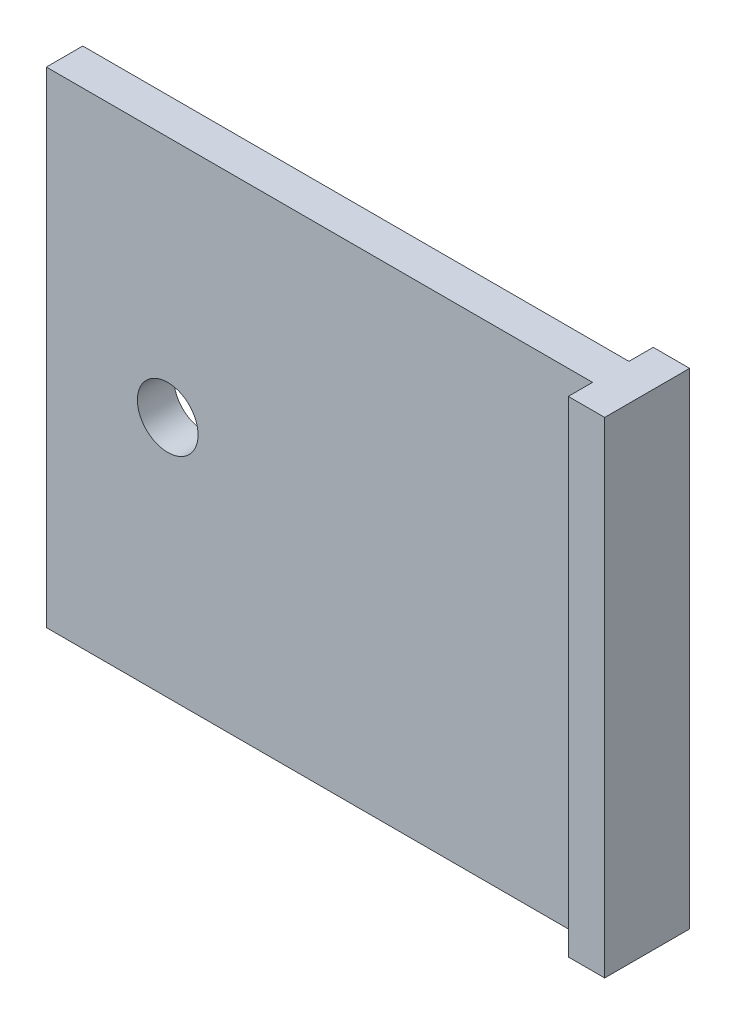
ISO-10303-21;
HEADER;
FILE_DESCRIPTION(('STEP AP214'),'2;1');
FILE_NAME('part.step','',(''),(''),'','','');
FILE_SCHEMA(('AUTOMOTIVE_DESIGN { 1 0 10303 214 1 1 1 1 }'));
ENDSEC;
DATA;
#1=APPLICATION_CONTEXT('core data for automotive mechanical design processes');
#2=APPLICATION_PROTOCOL_DEFINITION('international standard','automotive_design',2000,#1);
#3=PRODUCT_CONTEXT('',#1,'mechanical');
#4=PRODUCT('Part','Part','',(#3));
#5=PRODUCT_RELATED_PRODUCT_CATEGORY('part','',(#4));
#6=PRODUCT_DEFINITION_FORMATION('','',#4);
#7=PRODUCT_DEFINITION_CONTEXT('part definition',#1,'design');
#8=PRODUCT_DEFINITION('design','',#6,#7);
#9=PRODUCT_DEFINITION_SHAPE('','',#8);
#10=(LENGTH_UNIT() NAMED_UNIT(*) SI_UNIT(.MILLI.,.METRE.));
#11=(NAMED_UNIT(*) PLANE_ANGLE_UNIT() SI_UNIT($,.RADIAN.));
#12=(NAMED_UNIT(*) SI_UNIT($,.STERADIAN.) SOLID_ANGLE_UNIT());
#13=UNCERTAINTY_MEASURE_WITH_UNIT(LENGTH_MEASURE(1.E-05),#10,'distance_accuracy_value','');
#14=(GEOMETRIC_REPRESENTATION_CONTEXT(3) GLOBAL_UNCERTAINTY_ASSIGNED_CONTEXT((#13)) GLOBAL_UNIT_ASSIGNED_CONTEXT((#10,
#11,#12)) REPRESENTATION_CONTEXT('',''));
#15=CARTESIAN_POINT('',(0.,0.,0.));
#16=DIRECTION('',(0.,0.,1.));
#17=DIRECTION('',(1.,0.,0.));
#18=AXIS2_PLACEMENT_3D('',#15,#16,#17);
#19=CARTESIAN_POINT('',(0.,0.,3.));
#20=DIRECTION('',(0.,0.,-1.));
#21=DIRECTION('',(-1.,0.,0.));
#22=AXIS2_PLACEMENT_3D('',#19,#20,#21);
#23=PLANE('',#22);
#24=DIRECTION('',(0.,1.,0.));
#25=VECTOR('',#24,1.);
#26=CARTESIAN_POINT('',(22.5,-20.,3.));
#27=LINE('',#26,#25);
#28=CARTESIAN_POINT('',(22.5,-20.,3.));
#29=VERTEX_POINT('',#28);
#30=CARTESIAN_POINT('',(22.5,20.,3.));
#31=VERTEX_POINT('',#30);
#32=EDGE_CURVE('E93',#29,#31,#27,.T.);
#33=ORIENTED_EDGE('',*,*,#32,.T.);
#34=DIRECTION('',(-1.,0.,0.));
#35=VECTOR('',#34,1.);
#36=CARTESIAN_POINT('',(-22.5,20.,3.));
#37=LINE('',#36,#35);
#38=CARTESIAN_POINT('',(-22.5,20.,3.));
#39=VERTEX_POINT('',#38);
#40=EDGE_CURVE('E104',#31,#39,#37,.T.);
#41=ORIENTED_EDGE('',*,*,#40,.T.);
#42=DIRECTION('',(0.,-1.,0.));
#43=VECTOR('',#42,1.);
#44=CARTESIAN_POINT('',(-22.5,-20.,3.));
#45=LINE('',#44,#43);
#46=CARTESIAN_POINT('',(-22.5,-20.,3.));
#47=VERTEX_POINT('',#46);
#48=EDGE_CURVE('E57',#39,#47,#45,.T.);
#49=ORIENTED_EDGE('',*,*,#48,.T.);
#50=DIRECTION('',(1.,0.,0.));
#51=VECTOR('',#50,1.);
#52=CARTESIAN_POINT('',(-22.5,-20.,3.));
#53=LINE('',#52,#51);
#54=EDGE_CURVE('E109',#47,#29,#53,.T.);
#55=ORIENTED_EDGE('',*,*,#54,.T.);
#56=EDGE_LOOP('',(#33,#41,#49,#55));
#57=FACE_BOUND('',#56,.T.);
#58=CARTESIAN_POINT('',(-12.5,0.,3.));
#59=DIRECTION('',(0.,0.,1.));
#60=DIRECTION('',(1.,0.,0.));
#61=AXIS2_PLACEMENT_3D('',#58,#59,#60);
#62=CIRCLE('',#61,2.5);
#63=CARTESIAN_POINT('',(-10.,0.,3.));
#64=VERTEX_POINT('',#63);
#65=EDGE_CURVE('E127',#64,#64,#62,.T.);
#66=ORIENTED_EDGE('',*,*,#65,.F.);
#67=EDGE_LOOP('',(#66));
#68=FACE_BOUND('',#67,.T.);
#69=ADVANCED_FACE('F39',(#57,#68),#23,.F.);
#70=CARTESIAN_POINT('',(0.,0.,0.));
#71=DIRECTION('',(0.,0.,-1.));
#72=DIRECTION('',(-1.,0.,0.));
#73=AXIS2_PLACEMENT_3D('',#70,#71,#72);
#74=PLANE('',#73);
#75=DIRECTION('',(0.,1.,0.));
#76=VECTOR('',#75,1.);
#77=CARTESIAN_POINT('',(22.5,-20.,0.));
#78=LINE('',#77,#76);
#79=CARTESIAN_POINT('',(22.5,-20.,0.));
#80=VERTEX_POINT('',#79);
#81=CARTESIAN_POINT('',(22.5,20.,0.));
#82=VERTEX_POINT('',#81);
#83=EDGE_CURVE('E124',#80,#82,#78,.T.);
#84=ORIENTED_EDGE('',*,*,#83,.F.);
#85=DIRECTION('',(1.,0.,0.));
#86=VECTOR('',#85,1.);
#87=CARTESIAN_POINT('',(-22.5,-20.,0.));
#88=LINE('',#87,#86);
#89=CARTESIAN_POINT('',(-22.5,-20.,0.));
#90=VERTEX_POINT('',#89);
#91=EDGE_CURVE('E111',#90,#80,#88,.T.);
#92=ORIENTED_EDGE('',*,*,#91,.F.);
#93=DIRECTION('',(0.,-1.,0.));
#94=VECTOR('',#93,1.);
#95=CARTESIAN_POINT('',(-22.5,-20.,0.));
#96=LINE('',#95,#94);
#97=CARTESIAN_POINT('',(-22.5,20.,0.));
#98=VERTEX_POINT('',#97);
#99=EDGE_CURVE('E114',#98,#90,#96,.T.);
#100=ORIENTED_EDGE('',*,*,#99,.F.);
#101=DIRECTION('',(-1.,0.,0.));
#102=VECTOR('',#101,1.);
#103=CARTESIAN_POINT('',(-22.5,20.,0.));
#104=LINE('',#103,#102);
#105=EDGE_CURVE('E69',#82,#98,#104,.T.);
#106=ORIENTED_EDGE('',*,*,#105,.F.);
#107=EDGE_LOOP('',(#84,#92,#100,#106));
#108=FACE_BOUND('',#107,.T.);
#109=CARTESIAN_POINT('',(-12.5,0.,0.));
#110=DIRECTION('',(0.,0.,1.));
#111=DIRECTION('',(1.,0.,0.));
#112=AXIS2_PLACEMENT_3D('',#109,#110,#111);
#113=CIRCLE('',#112,2.5);
#114=CARTESIAN_POINT('',(-10.,0.,0.));
#115=VERTEX_POINT('',#114);
#116=EDGE_CURVE('E117',#115,#115,#113,.T.);
#117=ORIENTED_EDGE('',*,*,#116,.T.);
#118=EDGE_LOOP('',(#117));
#119=FACE_BOUND('',#118,.T.);
#120=ADVANCED_FACE('F140',(#108,#119),#74,.T.);
#121=CARTESIAN_POINT('',(-22.5,20.,3.));
#122=DIRECTION('',(0.,-1.,0.));
#123=DIRECTION('',(1.,0.,0.));
#124=AXIS2_PLACEMENT_3D('',#121,#122,#123);
#125=PLANE('',#124);
#126=ORIENTED_EDGE('',*,*,#105,.T.);
#127=DIRECTION('',(0.,0.,-1.));
#128=VECTOR('',#127,1.);
#129=CARTESIAN_POINT('',(-22.5,20.,3.));
#130=LINE('',#129,#128);
#131=EDGE_CURVE('E11',#39,#98,#130,.T.);
#132=ORIENTED_EDGE('',*,*,#131,.F.);
#133=ORIENTED_EDGE('',*,*,#40,.F.);
#134=DIRECTION('',(0.,0.,1.));
#135=VECTOR('',#134,1.);
#136=CARTESIAN_POINT('',(22.5,20.,3.));
#137=LINE('',#136,#135);
#138=CARTESIAN_POINT('',(22.5,20.,5.));
#139=VERTEX_POINT('',#138);
#140=EDGE_CURVE('E88',#31,#139,#137,.T.);
#141=ORIENTED_EDGE('',*,*,#140,.T.);
#142=DIRECTION('',(-1.,0.,0.));
#143=VECTOR('',#142,1.);
#144=CARTESIAN_POINT('',(25.5,20.,5.));
#145=LINE('',#144,#143);
#146=CARTESIAN_POINT('',(25.5,20.,5.));
#147=VERTEX_POINT('',#146);
#148=EDGE_CURVE('E159',#147,#139,#145,.T.);
#149=ORIENTED_EDGE('',*,*,#148,.F.);
#150=DIRECTION('',(0.,0.,1.));
#151=VECTOR('',#150,1.);
#152=CARTESIAN_POINT('',(25.5,20.,3.));
#153=LINE('',#152,#151);
#154=CARTESIAN_POINT('',(25.5,20.,-2.));
#155=VERTEX_POINT('',#154);
#156=EDGE_CURVE('E162',#155,#147,#153,.T.);
#157=ORIENTED_EDGE('',*,*,#156,.F.);
#158=DIRECTION('',(-1.,0.,0.));
#159=VECTOR('',#158,1.);
#160=CARTESIAN_POINT('',(25.5,20.,-2.));
#161=LINE('',#160,#159);
#162=CARTESIAN_POINT('',(22.5,20.,-2.));
#163=VERTEX_POINT('',#162);
#164=EDGE_CURVE('E149',#155,#163,#161,.T.);
#165=ORIENTED_EDGE('',*,*,#164,.T.);
#166=EDGE_CURVE('E101',#163,#82,#137,.T.);
#167=ORIENTED_EDGE('',*,*,#166,.T.);
#168=EDGE_LOOP('',(#126,#132,#133,#141,#149,#157,#165,#167));
#169=FACE_BOUND('',#168,.T.);
#170=ADVANCED_FACE('F41',(#169),#125,.F.);
#171=CARTESIAN_POINT('',(-22.5,-20.,3.));
#172=DIRECTION('',(1.,0.,0.));
#173=DIRECTION('',(0.,1.,0.));
#174=AXIS2_PLACEMENT_3D('',#171,#172,#173);
#175=PLANE('',#174);
#176=ORIENTED_EDGE('',*,*,#99,.T.);
#177=DIRECTION('',(0.,0.,-1.));
#178=VECTOR('',#177,1.);
#179=CARTESIAN_POINT('',(-22.5,-20.,3.));
#180=LINE('',#179,#178);
#181=EDGE_CURVE('E49',#47,#90,#180,.T.);
#182=ORIENTED_EDGE('',*,*,#181,.F.);
#183=ORIENTED_EDGE('',*,*,#48,.F.);
#184=ORIENTED_EDGE('',*,*,#131,.T.);
#185=EDGE_LOOP('',(#176,#182,#183,#184));
#186=FACE_BOUND('',#185,.T.);
#187=ADVANCED_FACE('F189',(#186),#175,.F.);
#188=CARTESIAN_POINT('',(-22.5,-20.,3.));
#189=DIRECTION('',(0.,1.,0.));
#190=DIRECTION('',(-1.,0.,0.));
#191=AXIS2_PLACEMENT_3D('',#188,#189,#190);
#192=PLANE('',#191);
#193=ORIENTED_EDGE('',*,*,#91,.T.);
#194=DIRECTION('',(0.,0.,-1.));
#195=VECTOR('',#194,1.);
#196=CARTESIAN_POINT('',(22.5,-20.,3.));
#197=LINE('',#196,#195);
#198=CARTESIAN_POINT('',(22.5,-20.,-2.));
#199=VERTEX_POINT('',#198);
#200=EDGE_CURVE('E78',#80,#199,#197,.T.);
#201=ORIENTED_EDGE('',*,*,#200,.T.);
#202=DIRECTION('',(-1.,0.,0.));
#203=VECTOR('',#202,1.);
#204=CARTESIAN_POINT('',(25.5,-20.,-2.));
#205=LINE('',#204,#203);
#206=CARTESIAN_POINT('',(25.5,-20.,-2.));
#207=VERTEX_POINT('',#206);
#208=EDGE_CURVE('E165',#207,#199,#205,.T.);
#209=ORIENTED_EDGE('',*,*,#208,.F.);
#210=DIRECTION('',(0.,0.,-1.));
#211=VECTOR('',#210,1.);
#212=CARTESIAN_POINT('',(25.5,-20.,3.));
#213=LINE('',#212,#211);
#214=CARTESIAN_POINT('',(25.5,-20.,5.));
#215=VERTEX_POINT('',#214);
#216=EDGE_CURVE('E154',#215,#207,#213,.T.);
#217=ORIENTED_EDGE('',*,*,#216,.F.);
#218=DIRECTION('',(-1.,0.,0.));
#219=VECTOR('',#218,1.);
#220=CARTESIAN_POINT('',(25.5,-20.,5.));
#221=LINE('',#220,#219);
#222=CARTESIAN_POINT('',(22.5,-20.,5.));
#223=VERTEX_POINT('',#222);
#224=EDGE_CURVE('E169',#215,#223,#221,.T.);
#225=ORIENTED_EDGE('',*,*,#224,.T.);
#226=EDGE_CURVE('E289',#223,#29,#197,.T.);
#227=ORIENTED_EDGE('',*,*,#226,.T.);
#228=ORIENTED_EDGE('',*,*,#54,.F.);
#229=ORIENTED_EDGE('',*,*,#181,.T.);
#230=EDGE_LOOP('',(#193,#201,#209,#217,#225,#227,#228,#229));
#231=FACE_BOUND('',#230,.T.);
#232=ADVANCED_FACE('F135',(#231),#192,.F.);
#233=CARTESIAN_POINT('',(-12.5,0.,3.));
#234=DIRECTION('',(0.,0.,-1.));
#235=DIRECTION('',(-1.,0.,0.));
#236=AXIS2_PLACEMENT_3D('',#233,#234,#235);
#237=CYLINDRICAL_SURFACE('',#236,2.5);
#238=ORIENTED_EDGE('',*,*,#65,.T.);
#239=EDGE_LOOP('',(#238));
#240=FACE_BOUND('',#239,.T.);
#241=ORIENTED_EDGE('',*,*,#116,.F.);
#242=EDGE_LOOP('',(#241));
#243=FACE_BOUND('',#242,.T.);
#244=ADVANCED_FACE('F180',(#240,#243),#237,.F.);
#245=CARTESIAN_POINT('',(22.5,0.,0.));
#246=DIRECTION('',(1.,0.,0.));
#247=DIRECTION('',(0.,1.,0.));
#248=AXIS2_PLACEMENT_3D('',#245,#246,#247);
#249=PLANE('',#248);
#250=ORIENTED_EDGE('',*,*,#200,.F.);
#251=ORIENTED_EDGE('',*,*,#83,.T.);
#252=ORIENTED_EDGE('',*,*,#166,.F.);
#253=DIRECTION('',(0.,1.,0.));
#254=VECTOR('',#253,1.);
#255=CARTESIAN_POINT('',(22.5,-20.,-2.));
#256=LINE('',#255,#254);
#257=EDGE_CURVE('E102',#199,#163,#256,.T.);
#258=ORIENTED_EDGE('',*,*,#257,.F.);
#259=EDGE_LOOP('',(#250,#251,#252,#258));
#260=FACE_BOUND('',#259,.T.);
#261=ADVANCED_FACE('F143',(#260),#249,.F.);
#262=CARTESIAN_POINT('',(25.5,-20.,5.));
#263=DIRECTION('',(0.,0.,-1.));
#264=DIRECTION('',(-1.,0.,0.));
#265=AXIS2_PLACEMENT_3D('',#262,#263,#264);
#266=PLANE('',#265);
#267=DIRECTION('',(0.,-1.,0.));
#268=VECTOR('',#267,1.);
#269=CARTESIAN_POINT('',(22.5,-20.,5.));
#270=LINE('',#269,#268);
#271=EDGE_CURVE('E97',#139,#223,#270,.T.);
#272=ORIENTED_EDGE('',*,*,#271,.T.);
#273=ORIENTED_EDGE('',*,*,#224,.F.);
#274=DIRECTION('',(0.,-1.,0.));
#275=VECTOR('',#274,1.);
#276=CARTESIAN_POINT('',(25.5,-20.,5.));
#277=LINE('',#276,#275);
#278=EDGE_CURVE('E151',#147,#215,#277,.T.);
#279=ORIENTED_EDGE('',*,*,#278,.F.);
#280=ORIENTED_EDGE('',*,*,#148,.T.);
#281=EDGE_LOOP('',(#272,#273,#279,#280));
#282=FACE_BOUND('',#281,.T.);
#283=ADVANCED_FACE('F187',(#282),#266,.F.);
#284=CARTESIAN_POINT('',(25.5,-20.,-2.));
#285=DIRECTION('',(0.,0.,1.));
#286=DIRECTION('',(1.,0.,0.));
#287=AXIS2_PLACEMENT_3D('',#284,#285,#286);
#288=PLANE('',#287);
#289=ORIENTED_EDGE('',*,*,#257,.T.);
#290=ORIENTED_EDGE('',*,*,#164,.F.);
#291=DIRECTION('',(0.,1.,0.));
#292=VECTOR('',#291,1.);
#293=CARTESIAN_POINT('',(25.5,-20.,-2.));
#294=LINE('',#293,#292);
#295=EDGE_CURVE('E308',#207,#155,#294,.T.);
#296=ORIENTED_EDGE('',*,*,#295,.F.);
#297=ORIENTED_EDGE('',*,*,#208,.T.);
#298=EDGE_LOOP('',(#289,#290,#296,#297));
#299=FACE_BOUND('',#298,.T.);
#300=ADVANCED_FACE('F248',(#299),#288,.F.);
#301=CARTESIAN_POINT('',(25.5,0.,0.));
#302=DIRECTION('',(1.,0.,0.));
#303=DIRECTION('',(0.,1.,0.));
#304=AXIS2_PLACEMENT_3D('',#301,#302,#303);
#305=PLANE('',#304);
#306=ORIENTED_EDGE('',*,*,#278,.T.);
#307=ORIENTED_EDGE('',*,*,#216,.T.);
#308=ORIENTED_EDGE('',*,*,#295,.T.);
#309=ORIENTED_EDGE('',*,*,#156,.T.);
#310=EDGE_LOOP('',(#306,#307,#308,#309));
#311=FACE_BOUND('',#310,.T.);
#312=ADVANCED_FACE('F256',(#311),#305,.T.);
#313=ORIENTED_EDGE('',*,*,#32,.F.);
#314=ORIENTED_EDGE('',*,*,#226,.F.);
#315=ORIENTED_EDGE('',*,*,#271,.F.);
#316=ORIENTED_EDGE('',*,*,#140,.F.);
#317=EDGE_LOOP('',(#313,#314,#315,#316));
#318=FACE_BOUND('',#317,.T.);
#319=ADVANCED_FACE('F90',(#318),#249,.F.);
#320=CLOSED_SHELL('',(#69,#120,#170,#187,#232,#244,#261,#283,#300,#312,#319));
#321=MANIFOLD_SOLID_BREP('B2',#320);
#322=ADVANCED_BREP_SHAPE_REPRESENTATION('',(#18,#321),#14);
#323=SHAPE_DEFINITION_REPRESENTATION(#9,#322);
ENDSEC;
END-ISO-10303-21;
